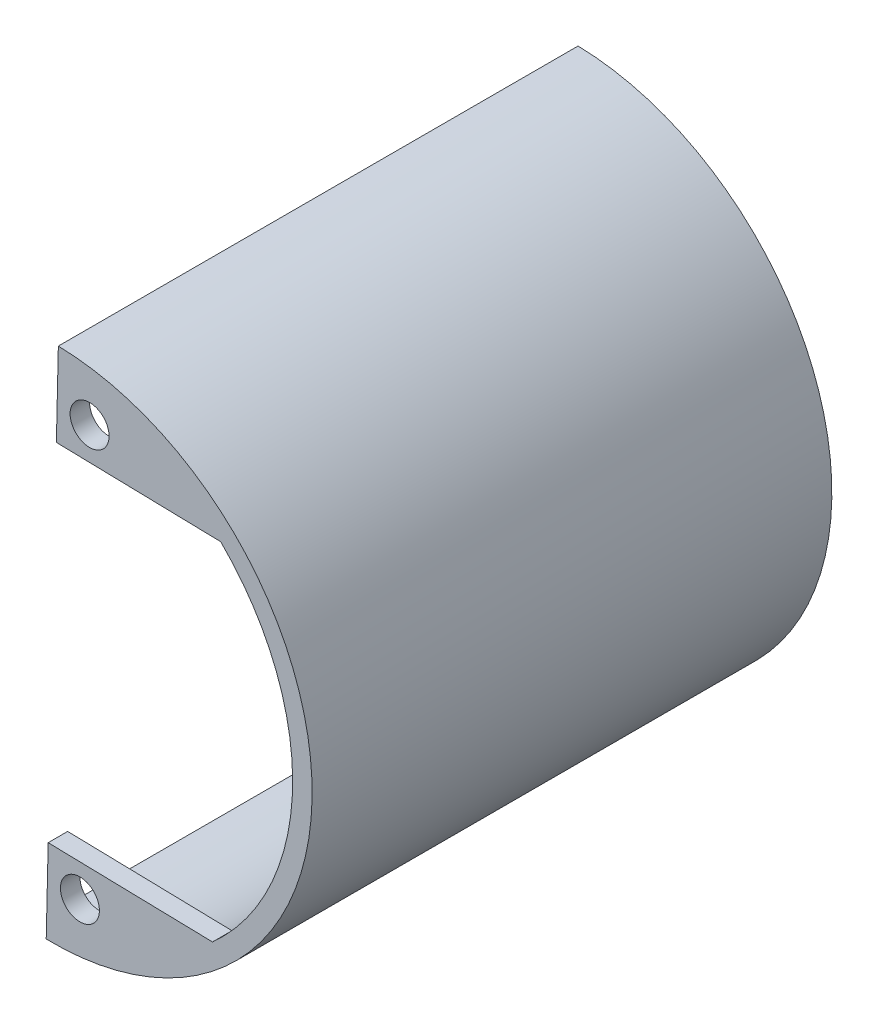
ISO-10303-21;
HEADER;
FILE_DESCRIPTION(('STEP AP214'),'2;1');
FILE_NAME('part.step','',(''),(''),'','','');
FILE_SCHEMA(('AUTOMOTIVE_DESIGN { 1 0 10303 214 1 1 1 1 }'));
ENDSEC;
DATA;
#1=APPLICATION_CONTEXT('core data for automotive mechanical design processes');
#2=APPLICATION_PROTOCOL_DEFINITION('international standard','automotive_design',2000,#1);
#3=PRODUCT_CONTEXT('',#1,'mechanical');
#4=PRODUCT('Part','Part','',(#3));
#5=PRODUCT_RELATED_PRODUCT_CATEGORY('part','',(#4));
#6=PRODUCT_DEFINITION_FORMATION('','',#4);
#7=PRODUCT_DEFINITION_CONTEXT('part definition',#1,'design');
#8=PRODUCT_DEFINITION('design','',#6,#7);
#9=PRODUCT_DEFINITION_SHAPE('','',#8);
#10=(LENGTH_UNIT() NAMED_UNIT(*) SI_UNIT(.MILLI.,.METRE.));
#11=(NAMED_UNIT(*) PLANE_ANGLE_UNIT() SI_UNIT($,.RADIAN.));
#12=(NAMED_UNIT(*) SI_UNIT($,.STERADIAN.) SOLID_ANGLE_UNIT());
#13=UNCERTAINTY_MEASURE_WITH_UNIT(LENGTH_MEASURE(1.E-05),#10,'distance_accuracy_value','');
#14=(GEOMETRIC_REPRESENTATION_CONTEXT(3) GLOBAL_UNCERTAINTY_ASSIGNED_CONTEXT((#13)) GLOBAL_UNIT_ASSIGNED_CONTEXT((#10,
#11,#12)) REPRESENTATION_CONTEXT('',''));
#15=CARTESIAN_POINT('',(0.,0.,0.));
#16=DIRECTION('',(0.,0.,1.));
#17=DIRECTION('',(1.,0.,0.));
#18=AXIS2_PLACEMENT_3D('',#15,#16,#17);
#19=CARTESIAN_POINT('',(0.,0.,80.));
#20=DIRECTION('',(0.,0.,-1.));
#21=DIRECTION('',(-1.,0.,0.));
#22=AXIS2_PLACEMENT_3D('',#19,#20,#21);
#23=CYLINDRICAL_SURFACE('',#22,37.);
#24=DIRECTION('',(0.,0.,-1.));
#25=VECTOR('',#24,1.);
#26=CARTESIAN_POINT('',(25.9214933263433,26.4022003577796,80.));
#27=LINE('',#26,#25);
#28=CARTESIAN_POINT('',(25.9214933263433,26.4022003577796,77.));
#29=VERTEX_POINT('',#28);
#30=CARTESIAN_POINT('',(25.9214933263433,26.4022003577796,80.));
#31=VERTEX_POINT('',#30);
#32=EDGE_CURVE('E49',#29,#31,#27,.F.);
#33=ORIENTED_EDGE('',*,*,#32,.F.);
#34=CARTESIAN_POINT('',(0.,0.,77.));
#35=DIRECTION('',(0.,0.,-1.));
#36=DIRECTION('',(-1.,0.,0.));
#37=AXIS2_PLACEMENT_3D('',#34,#35,#36);
#38=CIRCLE('',#37,37.);
#39=CARTESIAN_POINT('',(0.863557103937861,36.9899211830498,77.));
#40=VERTEX_POINT('',#39);
#41=EDGE_CURVE('E84',#40,#29,#38,.T.);
#42=ORIENTED_EDGE('',*,*,#41,.F.);
#43=DIRECTION('',(0.,0.,-1.));
#44=VECTOR('',#43,1.);
#45=CARTESIAN_POINT('',(0.863557103926731,36.9899211830501,80.));
#46=LINE('',#45,#44);
#47=CARTESIAN_POINT('',(0.863557103926731,36.9899211830501,0.));
#48=VERTEX_POINT('',#47);
#49=EDGE_CURVE('E77',#40,#48,#46,.T.);
#50=ORIENTED_EDGE('',*,*,#49,.T.);
#51=CARTESIAN_POINT('',(0.,0.,0.));
#52=DIRECTION('',(0.,0.,-1.));
#53=DIRECTION('',(1.,0.,0.));
#54=AXIS2_PLACEMENT_3D('',#51,#52,#53);
#55=CIRCLE('',#54,37.);
#56=CARTESIAN_POINT('',(-0.863557103938413,-36.9899211830498,0.));
#57=VERTEX_POINT('',#56);
#58=EDGE_CURVE('E81',#48,#57,#55,.T.);
#59=ORIENTED_EDGE('',*,*,#58,.T.);
#60=DIRECTION('',(0.,0.,-1.));
#61=VECTOR('',#60,1.);
#62=CARTESIAN_POINT('',(-0.863557103938413,-36.9899211830498,80.));
#63=LINE('',#62,#61);
#64=CARTESIAN_POINT('',(-0.863557103938413,-36.9899211830498,77.));
#65=VERTEX_POINT('',#64);
#66=EDGE_CURVE('E11',#65,#57,#63,.T.);
#67=ORIENTED_EDGE('',*,*,#66,.F.);
#68=CARTESIAN_POINT('',(0.,0.,77.));
#69=DIRECTION('',(0.,0.,-1.));
#70=DIRECTION('',(-1.,0.,0.));
#71=AXIS2_PLACEMENT_3D('',#68,#69,#70);
#72=CIRCLE('',#71,37.);
#73=CARTESIAN_POINT('',(24.6611667422178,-27.5830900174823,77.));
#74=VERTEX_POINT('',#73);
#75=EDGE_CURVE('E103',#74,#65,#72,.T.);
#76=ORIENTED_EDGE('',*,*,#75,.F.);
#77=DIRECTION('',(0.,0.,-1.));
#78=VECTOR('',#77,1.);
#79=CARTESIAN_POINT('',(24.6611667422178,-27.5830900174823,80.));
#80=LINE('',#79,#78);
#81=CARTESIAN_POINT('',(24.6611667422178,-27.5830900174823,80.));
#82=VERTEX_POINT('',#81);
#83=EDGE_CURVE('E107',#82,#74,#80,.T.);
#84=ORIENTED_EDGE('',*,*,#83,.F.);
#85=CARTESIAN_POINT('',(0.,0.,80.));
#86=DIRECTION('',(0.,0.,-1.));
#87=DIRECTION('',(1.,0.,0.));
#88=AXIS2_PLACEMENT_3D('',#85,#86,#87);
#89=CIRCLE('',#88,37.);
#90=EDGE_CURVE('E97',#31,#82,#89,.T.);
#91=ORIENTED_EDGE('',*,*,#90,.F.);
#92=EDGE_LOOP('',(#33,#42,#50,#59,#67,#76,#84,#91));
#93=FACE_BOUND('',#92,.T.);
#94=ADVANCED_FACE('F35',(#93),#23,.F.);
#95=CARTESIAN_POINT('',(-0.863557103938413,-36.9899211830498,80.));
#96=DIRECTION('',(0.999727599541892,-0.0233393811873272,0.));
#97=DIRECTION('',(0.0233393811873272,0.999727599541892,0.));
#98=AXIS2_PLACEMENT_3D('',#95,#96,#97);
#99=PLANE('',#98);
#100=DIRECTION('',(-0.0233393811873272,-0.999727599541891,0.));
#101=VECTOR('',#100,1.);
#102=CARTESIAN_POINT('',(-0.863557103938413,-36.9899211830498,0.));
#103=LINE('',#102,#101);
#104=CARTESIAN_POINT('',(-0.933575247500395,-39.9891039816755,0.));
#105=VERTEX_POINT('',#104);
#106=EDGE_CURVE('E102',#57,#105,#103,.T.);
#107=ORIENTED_EDGE('',*,*,#106,.T.);
#108=DIRECTION('',(0.,0.,-1.));
#109=VECTOR('',#108,1.);
#110=CARTESIAN_POINT('',(-0.933575247500395,-39.9891039816755,80.));
#111=LINE('',#110,#109);
#112=CARTESIAN_POINT('',(-0.933575247500395,-39.9891039816755,80.));
#113=VERTEX_POINT('',#112);
#114=EDGE_CURVE('E42',#113,#105,#111,.T.);
#115=ORIENTED_EDGE('',*,*,#114,.F.);
#116=DIRECTION('',(-0.0233393811873272,-0.999727599541891,0.));
#117=VECTOR('',#116,1.);
#118=CARTESIAN_POINT('',(-0.863557103938413,-36.9899211830498,80.));
#119=LINE('',#118,#117);
#120=CARTESIAN_POINT('',(-0.630163292062745,-26.992645187631,80.));
#121=VERTEX_POINT('',#120);
#122=EDGE_CURVE('E122',#121,#113,#119,.T.);
#123=ORIENTED_EDGE('',*,*,#122,.F.);
#124=DIRECTION('',(0.,0.,-1.));
#125=VECTOR('',#124,1.);
#126=CARTESIAN_POINT('',(-0.630163292062745,-26.992645187631,80.));
#127=LINE('',#126,#125);
#128=CARTESIAN_POINT('',(-0.630163292062745,-26.992645187631,77.));
#129=VERTEX_POINT('',#128);
#130=EDGE_CURVE('E150',#121,#129,#127,.T.);
#131=ORIENTED_EDGE('',*,*,#130,.T.);
#132=DIRECTION('',(-0.0233393811875091,-0.999727599541887,0.));
#133=VECTOR('',#132,1.);
#134=CARTESIAN_POINT('',(-0.630163292062745,-26.992645187631,77.));
#135=LINE('',#134,#133);
#136=EDGE_CURVE('E127',#129,#65,#135,.T.);
#137=ORIENTED_EDGE('',*,*,#136,.T.);
#138=ORIENTED_EDGE('',*,*,#66,.T.);
#139=EDGE_LOOP('',(#107,#115,#123,#131,#137,#138));
#140=FACE_BOUND('',#139,.T.);
#141=ADVANCED_FACE('F119',(#140),#99,.F.);
#142=CARTESIAN_POINT('',(0.,0.,80.));
#143=DIRECTION('',(0.,0.,-1.));
#144=DIRECTION('',(-1.,0.,0.));
#145=AXIS2_PLACEMENT_3D('',#142,#143,#144);
#146=CYLINDRICAL_SURFACE('',#145,40.);
#147=CARTESIAN_POINT('',(0.,0.,0.));
#148=DIRECTION('',(0.,0.,1.));
#149=DIRECTION('',(1.,0.,0.));
#150=AXIS2_PLACEMENT_3D('',#147,#148,#149);
#151=CIRCLE('',#150,40.);
#152=CARTESIAN_POINT('',(0.933575247488827,39.9891039816758,0.));
#153=VERTEX_POINT('',#152);
#154=EDGE_CURVE('E98',#105,#153,#151,.T.);
#155=ORIENTED_EDGE('',*,*,#154,.T.);
#156=DIRECTION('',(0.,0.,-1.));
#157=VECTOR('',#156,1.);
#158=CARTESIAN_POINT('',(0.933575247488827,39.9891039816758,80.));
#159=LINE('',#158,#157);
#160=CARTESIAN_POINT('',(0.933575247488827,39.9891039816758,80.));
#161=VERTEX_POINT('',#160);
#162=EDGE_CURVE('E87',#161,#153,#159,.T.);
#163=ORIENTED_EDGE('',*,*,#162,.F.);
#164=CARTESIAN_POINT('',(0.,0.,80.));
#165=DIRECTION('',(0.,0.,1.));
#166=DIRECTION('',(1.,0.,0.));
#167=AXIS2_PLACEMENT_3D('',#164,#165,#166);
#168=CIRCLE('',#167,40.);
#169=EDGE_CURVE('E58',#113,#161,#168,.T.);
#170=ORIENTED_EDGE('',*,*,#169,.F.);
#171=ORIENTED_EDGE('',*,*,#114,.T.);
#172=EDGE_LOOP('',(#155,#163,#170,#171));
#173=FACE_BOUND('',#172,.T.);
#174=ADVANCED_FACE('F116',(#173),#146,.T.);
#175=CARTESIAN_POINT('',(0.933575247488827,39.9891039816758,80.));
#176=DIRECTION('',(0.999727599541891,-0.0233393811873652,0.));
#177=DIRECTION('',(0.0233393811873652,0.999727599541891,0.));
#178=AXIS2_PLACEMENT_3D('',#175,#176,#177);
#179=PLANE('',#178);
#180=DIRECTION('',(-0.0233393811873652,-0.999727599541891,0.));
#181=VECTOR('',#180,1.);
#182=CARTESIAN_POINT('',(0.933575247488827,39.9891039816758,0.));
#183=LINE('',#182,#181);
#184=EDGE_CURVE('E92',#153,#48,#183,.T.);
#185=ORIENTED_EDGE('',*,*,#184,.T.);
#186=ORIENTED_EDGE('',*,*,#49,.F.);
#187=DIRECTION('',(-0.0233393811875097,-0.999727599541887,0.));
#188=VECTOR('',#187,1.);
#189=CARTESIAN_POINT('',(0.630163292062763,26.992645187631,77.));
#190=LINE('',#189,#188);
#191=CARTESIAN_POINT('',(0.630163292062763,26.992645187631,77.));
#192=VERTEX_POINT('',#191);
#193=EDGE_CURVE('E169',#40,#192,#190,.T.);
#194=ORIENTED_EDGE('',*,*,#193,.T.);
#195=DIRECTION('',(0.,0.,1.));
#196=VECTOR('',#195,1.);
#197=CARTESIAN_POINT('',(0.630163292062763,26.992645187631,80.));
#198=LINE('',#197,#196);
#199=CARTESIAN_POINT('',(0.630163292062763,26.992645187631,80.));
#200=VERTEX_POINT('',#199);
#201=EDGE_CURVE('E167',#192,#200,#198,.T.);
#202=ORIENTED_EDGE('',*,*,#201,.T.);
#203=DIRECTION('',(-0.0233393811873652,-0.999727599541891,0.));
#204=VECTOR('',#203,1.);
#205=CARTESIAN_POINT('',(0.933575247488827,39.9891039816758,80.));
#206=LINE('',#205,#204);
#207=EDGE_CURVE('E88',#161,#200,#206,.T.);
#208=ORIENTED_EDGE('',*,*,#207,.F.);
#209=ORIENTED_EDGE('',*,*,#162,.T.);
#210=EDGE_LOOP('',(#185,#186,#194,#202,#208,#209));
#211=FACE_BOUND('',#210,.T.);
#212=ADVANCED_FACE('F93',(#211),#179,.F.);
#213=CARTESIAN_POINT('',(0.,0.,80.));
#214=DIRECTION('',(0.,0.,1.));
#215=DIRECTION('',(1.,0.,0.));
#216=AXIS2_PLACEMENT_3D('',#213,#214,#215);
#217=PLANE('',#216);
#218=CARTESIAN_POINT('',(4.25177779970886,-32.1079800912779,80.));
#219=DIRECTION('',(0.,0.,1.));
#220=DIRECTION('',(1.,0.,0.));
#221=AXIS2_PLACEMENT_3D('',#218,#219,#220);
#222=CIRCLE('',#221,3.);
#223=CARTESIAN_POINT('',(7.25177779970886,-32.1079800912779,80.));
#224=VERTEX_POINT('',#223);
#225=EDGE_CURVE('E182',#224,#224,#222,.F.);
#226=ORIENTED_EDGE('',*,*,#225,.T.);
#227=EDGE_LOOP('',(#226));
#228=FACE_BOUND('',#227,.T.);
#229=CARTESIAN_POINT('',(5.74549819569863,31.8745862794031,80.));
#230=DIRECTION('',(0.,0.,1.));
#231=DIRECTION('',(1.,0.,0.));
#232=AXIS2_PLACEMENT_3D('',#229,#230,#231);
#233=CIRCLE('',#232,3.);
#234=CARTESIAN_POINT('',(8.74549819569863,31.8745862794031,80.));
#235=VERTEX_POINT('',#234);
#236=EDGE_CURVE('E172',#235,#235,#233,.F.);
#237=ORIENTED_EDGE('',*,*,#236,.T.);
#238=EDGE_LOOP('',(#237));
#239=FACE_BOUND('',#238,.T.);
#240=ORIENTED_EDGE('',*,*,#207,.T.);
#241=DIRECTION('',(-0.999727599541887,0.0233393811875097,0.));
#242=VECTOR('',#241,1.);
#243=CARTESIAN_POINT('',(41.5427179529662,26.0375113001368,80.));
#244=LINE('',#243,#242);
#245=EDGE_CURVE('E145',#31,#200,#244,.T.);
#246=ORIENTED_EDGE('',*,*,#245,.F.);
#247=ORIENTED_EDGE('',*,*,#90,.T.);
#248=DIRECTION('',(-0.999727599541887,0.0233393811875091,0.));
#249=VECTOR('',#248,1.);
#250=CARTESIAN_POINT('',(40.2823913688407,-27.9477790751251,80.));
#251=LINE('',#250,#249);
#252=EDGE_CURVE('E143',#82,#121,#251,.T.);
#253=ORIENTED_EDGE('',*,*,#252,.T.);
#254=ORIENTED_EDGE('',*,*,#122,.T.);
#255=ORIENTED_EDGE('',*,*,#169,.T.);
#256=EDGE_LOOP('',(#240,#246,#247,#253,#254,#255));
#257=FACE_BOUND('',#256,.T.);
#258=ADVANCED_FACE('F142',(#228,#239,#257),#217,.T.);
#259=CARTESIAN_POINT('',(0.,0.,0.));
#260=DIRECTION('',(0.,0.,1.));
#261=DIRECTION('',(1.,0.,0.));
#262=AXIS2_PLACEMENT_3D('',#259,#260,#261);
#263=PLANE('',#262);
#264=ORIENTED_EDGE('',*,*,#58,.F.);
#265=ORIENTED_EDGE('',*,*,#184,.F.);
#266=ORIENTED_EDGE('',*,*,#154,.F.);
#267=ORIENTED_EDGE('',*,*,#106,.F.);
#268=EDGE_LOOP('',(#264,#265,#266,#267));
#269=FACE_BOUND('',#268,.T.);
#270=ADVANCED_FACE('F101',(#269),#263,.F.);
#271=CARTESIAN_POINT('',(40.2823913688407,-27.9477790751251,80.));
#272=DIRECTION('',(0.0233393811875091,0.999727599541887,0.));
#273=DIRECTION('',(-0.999727599541887,0.0233393811875091,0.));
#274=AXIS2_PLACEMENT_3D('',#271,#272,#273);
#275=PLANE('',#274);
#276=ORIENTED_EDGE('',*,*,#252,.F.);
#277=ORIENTED_EDGE('',*,*,#83,.T.);
#278=DIRECTION('',(-0.999727599541887,0.0233393811875091,0.));
#279=VECTOR('',#278,1.);
#280=CARTESIAN_POINT('',(40.2823913688407,-27.9477790751251,77.));
#281=LINE('',#280,#279);
#282=EDGE_CURVE('E151',#74,#129,#281,.T.);
#283=ORIENTED_EDGE('',*,*,#282,.T.);
#284=ORIENTED_EDGE('',*,*,#130,.F.);
#285=EDGE_LOOP('',(#276,#277,#283,#284));
#286=FACE_BOUND('',#285,.T.);
#287=ADVANCED_FACE('F149',(#286),#275,.T.);
#288=CARTESIAN_POINT('',(40.2823913688407,-27.9477790751251,77.));
#289=DIRECTION('',(0.,0.,-1.));
#290=DIRECTION('',(-1.,0.,0.));
#291=AXIS2_PLACEMENT_3D('',#288,#289,#290);
#292=PLANE('',#291);
#293=CARTESIAN_POINT('',(4.25177779970886,-32.1079800912779,77.));
#294=DIRECTION('',(0.,0.,-1.));
#295=DIRECTION('',(-1.,0.,0.));
#296=AXIS2_PLACEMENT_3D('',#293,#294,#295);
#297=CIRCLE('',#296,3.);
#298=CARTESIAN_POINT('',(1.25177779970885,-32.1079800912779,77.));
#299=VERTEX_POINT('',#298);
#300=EDGE_CURVE('E185',#299,#299,#297,.T.);
#301=ORIENTED_EDGE('',*,*,#300,.F.);
#302=EDGE_LOOP('',(#301));
#303=FACE_BOUND('',#302,.T.);
#304=ORIENTED_EDGE('',*,*,#282,.F.);
#305=ORIENTED_EDGE('',*,*,#75,.T.);
#306=ORIENTED_EDGE('',*,*,#136,.F.);
#307=EDGE_LOOP('',(#304,#305,#306));
#308=FACE_BOUND('',#307,.T.);
#309=ADVANCED_FACE('F192',(#303,#308),#292,.T.);
#310=CARTESIAN_POINT('',(41.5427179529662,26.0375113001368,77.));
#311=DIRECTION('',(0.,0.,-1.));
#312=DIRECTION('',(-1.,0.,0.));
#313=AXIS2_PLACEMENT_3D('',#310,#311,#312);
#314=PLANE('',#313);
#315=CARTESIAN_POINT('',(5.74549819569863,31.8745862794031,77.));
#316=DIRECTION('',(0.,0.,-1.));
#317=DIRECTION('',(-1.,0.,0.));
#318=AXIS2_PLACEMENT_3D('',#315,#316,#317);
#319=CIRCLE('',#318,3.);
#320=CARTESIAN_POINT('',(2.74549819569863,31.8745862794031,77.));
#321=VERTEX_POINT('',#320);
#322=EDGE_CURVE('E179',#321,#321,#319,.T.);
#323=ORIENTED_EDGE('',*,*,#322,.F.);
#324=EDGE_LOOP('',(#323));
#325=FACE_BOUND('',#324,.T.);
#326=ORIENTED_EDGE('',*,*,#193,.F.);
#327=ORIENTED_EDGE('',*,*,#41,.T.);
#328=DIRECTION('',(-0.999727599541887,0.0233393811875097,0.));
#329=VECTOR('',#328,1.);
#330=CARTESIAN_POINT('',(41.5427179529662,26.0375113001368,77.));
#331=LINE('',#330,#329);
#332=EDGE_CURVE('E156',#29,#192,#331,.T.);
#333=ORIENTED_EDGE('',*,*,#332,.T.);
#334=EDGE_LOOP('',(#326,#327,#333));
#335=FACE_BOUND('',#334,.T.);
#336=ADVANCED_FACE('F194',(#325,#335),#314,.T.);
#337=CARTESIAN_POINT('',(41.5427179529662,26.0375113001368,80.));
#338=DIRECTION('',(-0.0233393811875097,-0.999727599541887,0.));
#339=DIRECTION('',(0.999727599541887,-0.0233393811875097,0.));
#340=AXIS2_PLACEMENT_3D('',#337,#338,#339);
#341=PLANE('',#340);
#342=ORIENTED_EDGE('',*,*,#332,.F.);
#343=ORIENTED_EDGE('',*,*,#32,.T.);
#344=ORIENTED_EDGE('',*,*,#245,.T.);
#345=ORIENTED_EDGE('',*,*,#201,.F.);
#346=EDGE_LOOP('',(#342,#343,#344,#345));
#347=FACE_BOUND('',#346,.T.);
#348=ADVANCED_FACE('F166',(#347),#341,.T.);
#349=CARTESIAN_POINT('',(5.74549819569863,31.8745862794031,88.4852813742386));
#350=DIRECTION('',(0.,0.,-1.));
#351=DIRECTION('',(-1.,0.,0.));
#352=AXIS2_PLACEMENT_3D('',#349,#350,#351);
#353=CYLINDRICAL_SURFACE('',#352,3.);
#354=ORIENTED_EDGE('',*,*,#322,.T.);
#355=EDGE_LOOP('',(#354));
#356=FACE_BOUND('',#355,.T.);
#357=ORIENTED_EDGE('',*,*,#236,.F.);
#358=EDGE_LOOP('',(#357));
#359=FACE_BOUND('',#358,.T.);
#360=ADVANCED_FACE('F224',(#356,#359),#353,.F.);
#361=CARTESIAN_POINT('',(4.25177779970886,-32.1079800912779,88.4852813742386));
#362=DIRECTION('',(0.,0.,-1.));
#363=DIRECTION('',(-1.,0.,0.));
#364=AXIS2_PLACEMENT_3D('',#361,#362,#363);
#365=CYLINDRICAL_SURFACE('',#364,3.);
#366=ORIENTED_EDGE('',*,*,#300,.T.);
#367=EDGE_LOOP('',(#366));
#368=FACE_BOUND('',#367,.T.);
#369=ORIENTED_EDGE('',*,*,#225,.F.);
#370=EDGE_LOOP('',(#369));
#371=FACE_BOUND('',#370,.T.);
#372=ADVANCED_FACE('F189',(#368,#371),#365,.F.);
#373=CLOSED_SHELL('',(#94,#141,#174,#212,#258,#270,#287,#309,#336,#348,#360,#372));
#374=MANIFOLD_SOLID_BREP('B2',#373);
#375=ADVANCED_BREP_SHAPE_REPRESENTATION('',(#18,#374),#14);
#376=SHAPE_DEFINITION_REPRESENTATION(#9,#375);
ENDSEC;
END-ISO-10303-21;
